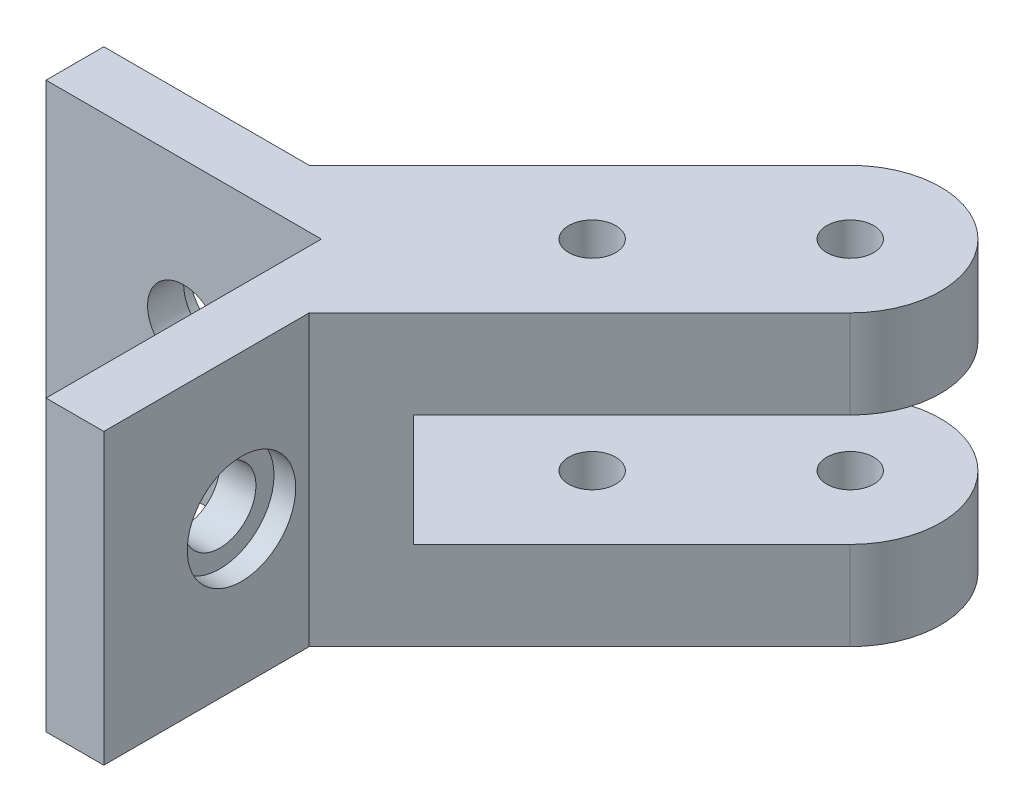
ISO-10303-21;
HEADER;
FILE_DESCRIPTION(('STEP AP214'),'2;1');
FILE_NAME('part.step','',(''),(''),'','','');
FILE_SCHEMA(('AUTOMOTIVE_DESIGN { 1 0 10303 214 1 1 1 1 }'));
ENDSEC;
DATA;
#1=APPLICATION_CONTEXT('core data for automotive mechanical design processes');
#2=APPLICATION_PROTOCOL_DEFINITION('international standard','automotive_design',2000,#1);
#3=PRODUCT_CONTEXT('',#1,'mechanical');
#4=PRODUCT('Part','Part','',(#3));
#5=PRODUCT_RELATED_PRODUCT_CATEGORY('part','',(#4));
#6=PRODUCT_DEFINITION_FORMATION('','',#4);
#7=PRODUCT_DEFINITION_CONTEXT('part definition',#1,'design');
#8=PRODUCT_DEFINITION('design','',#6,#7);
#9=PRODUCT_DEFINITION_SHAPE('','',#8);
#10=(LENGTH_UNIT() NAMED_UNIT(*) SI_UNIT(.MILLI.,.METRE.));
#11=(NAMED_UNIT(*) PLANE_ANGLE_UNIT() SI_UNIT($,.RADIAN.));
#12=(NAMED_UNIT(*) SI_UNIT($,.STERADIAN.) SOLID_ANGLE_UNIT());
#13=UNCERTAINTY_MEASURE_WITH_UNIT(LENGTH_MEASURE(1.E-05),#10,'distance_accuracy_value','');
#14=(GEOMETRIC_REPRESENTATION_CONTEXT(3) GLOBAL_UNCERTAINTY_ASSIGNED_CONTEXT((#13)) GLOBAL_UNIT_ASSIGNED_CONTEXT((#10,
#11,#12)) REPRESENTATION_CONTEXT('',''));
#15=CARTESIAN_POINT('',(0.,0.,0.));
#16=DIRECTION('',(0.,0.,1.));
#17=DIRECTION('',(1.,0.,0.));
#18=AXIS2_PLACEMENT_3D('',#15,#16,#17);
#19=CARTESIAN_POINT('',(-19.05,20.,-50.));
#20=DIRECTION('',(0.,0.,1.));
#21=DIRECTION('',(1.,0.,0.));
#22=AXIS2_PLACEMENT_3D('',#19,#20,#21);
#23=CYLINDRICAL_SURFACE('',#22,5.);
#24=CARTESIAN_POINT('',(-19.05,20.,0.));
#25=DIRECTION('',(0.,0.,1.));
#26=DIRECTION('',(1.,0.,0.));
#27=AXIS2_PLACEMENT_3D('',#24,#25,#26);
#28=CIRCLE('',#27,5.);
#29=CARTESIAN_POINT('',(-14.05,20.,0.));
#30=VERTEX_POINT('',#29);
#31=EDGE_CURVE('E319',#30,#30,#28,.T.);
#32=ORIENTED_EDGE('',*,*,#31,.T.);
#33=EDGE_LOOP('',(#32));
#34=FACE_BOUND('',#33,.T.);
#35=CARTESIAN_POINT('',(-19.05,20.,-5.));
#36=DIRECTION('',(0.,0.,-1.));
#37=DIRECTION('',(-1.,0.,0.));
#38=AXIS2_PLACEMENT_3D('',#35,#36,#37);
#39=CIRCLE('',#38,5.);
#40=CARTESIAN_POINT('',(-24.05,20.,-5.));
#41=VERTEX_POINT('',#40);
#42=EDGE_CURVE('E43',#41,#41,#39,.F.);
#43=ORIENTED_EDGE('',*,*,#42,.F.);
#44=EDGE_LOOP('',(#43));
#45=FACE_BOUND('',#44,.T.);
#46=ADVANCED_FACE('F39',(#34,#45),#23,.F.);
#47=CARTESIAN_POINT('',(36.5927759264038,0.,-36.5927759264039));
#48=DIRECTION('',(0.,1.,0.));
#49=DIRECTION('',(0.,0.,1.));
#50=AXIS2_PLACEMENT_3D('',#47,#48,#49);
#51=PLANE('',#50);
#52=DIRECTION('',(0.707106781186552,0.,0.707106781186543));
#53=VECTOR('',#52,1.);
#54=CARTESIAN_POINT('',(30.9044650609867,0.,-35.0685976237182));
#55=LINE('',#54,#53);
#56=CARTESIAN_POINT('',(30.9044650609867,0.,-35.0685976237182));
#57=VERTEX_POINT('',#56);
#58=CARTESIAN_POINT('',(35.0685976237181,0.,-30.9044650609868));
#59=VERTEX_POINT('',#58);
#60=EDGE_CURVE('E65',#57,#59,#55,.T.);
#61=ORIENTED_EDGE('',*,*,#60,.T.);
#62=DIRECTION('',(0.965925826289067,0.,-0.258819045102524));
#63=VECTOR('',#62,1.);
#64=CARTESIAN_POINT('',(35.0685976237181,0.,-30.9044650609868));
#65=LINE('',#64,#63);
#66=CARTESIAN_POINT('',(40.7569084891352,0.,-32.4286433636725));
#67=VERTEX_POINT('',#66);
#68=EDGE_CURVE('E270',#59,#67,#65,.T.);
#69=ORIENTED_EDGE('',*,*,#68,.T.);
#70=DIRECTION('',(0.258819045102512,0.,-0.965925826289071));
#71=VECTOR('',#70,1.);
#72=CARTESIAN_POINT('',(40.7569084891352,0.,-32.4286433636725));
#73=LINE('',#72,#71);
#74=CARTESIAN_POINT('',(42.2810867918208,0.,-38.1169542290896));
#75=VERTEX_POINT('',#74);
#76=EDGE_CURVE('E274',#67,#75,#73,.T.);
#77=ORIENTED_EDGE('',*,*,#76,.T.);
#78=DIRECTION('',(-0.707106781186552,0.,-0.707106781186543));
#79=VECTOR('',#78,1.);
#80=CARTESIAN_POINT('',(42.2810867918208,0.,-38.1169542290896));
#81=LINE('',#80,#79);
#82=CARTESIAN_POINT('',(38.1169542290894,0.,-42.281086791821));
#83=VERTEX_POINT('',#82);
#84=EDGE_CURVE('E278',#75,#83,#81,.T.);
#85=ORIENTED_EDGE('',*,*,#84,.T.);
#86=DIRECTION('',(-0.965925826289068,0.,0.258819045102522));
#87=VECTOR('',#86,1.);
#88=CARTESIAN_POINT('',(38.1169542290894,0.,-42.281086791821));
#89=LINE('',#88,#87);
#90=CARTESIAN_POINT('',(32.4286433636723,0.,-40.7569084891353));
#91=VERTEX_POINT('',#90);
#92=EDGE_CURVE('E282',#83,#91,#89,.T.);
#93=ORIENTED_EDGE('',*,*,#92,.T.);
#94=DIRECTION('',(-0.258819045102509,0.,0.965925826289071));
#95=VECTOR('',#94,1.);
#96=CARTESIAN_POINT('',(32.4286433636723,0.,-40.7569084891353));
#97=LINE('',#96,#95);
#98=EDGE_CURVE('E252',#91,#57,#97,.T.);
#99=ORIENTED_EDGE('',*,*,#98,.T.);
#100=EDGE_LOOP('',(#61,#69,#77,#85,#93,#99));
#101=FACE_BOUND('',#100,.T.);
#102=DIRECTION('',(1.,0.,0.));
#103=VECTOR('',#102,1.);
#104=CARTESIAN_POINT('',(0.,0.,0.));
#105=LINE('',#104,#103);
#106=CARTESIAN_POINT('',(-38.1,0.,0.));
#107=VERTEX_POINT('',#106);
#108=CARTESIAN_POINT('',(0.,0.,0.));
#109=VERTEX_POINT('',#108);
#110=EDGE_CURVE('E377',#107,#109,#105,.T.);
#111=ORIENTED_EDGE('',*,*,#110,.F.);
#112=DIRECTION('',(0.,0.,1.));
#113=VECTOR('',#112,1.);
#114=CARTESIAN_POINT('',(-38.1,0.,0.));
#115=LINE('',#114,#113);
#116=CARTESIAN_POINT('',(-38.1,0.,-8.));
#117=VERTEX_POINT('',#116);
#118=EDGE_CURVE('E383',#117,#107,#115,.T.);
#119=ORIENTED_EDGE('',*,*,#118,.F.);
#120=DIRECTION('',(-1.,0.,0.));
#121=VECTOR('',#120,1.);
#122=CARTESIAN_POINT('',(-38.1,0.,-8.));
#123=LINE('',#122,#121);
#124=CARTESIAN_POINT('',(-9.67766952966368,0.,-8.));
#125=VERTEX_POINT('',#124);
#126=EDGE_CURVE('E431',#125,#117,#123,.T.);
#127=ORIENTED_EDGE('',*,*,#126,.F.);
#128=DIRECTION('',(-0.707106781186546,0.,0.707106781186549));
#129=VECTOR('',#128,1.);
#130=CARTESIAN_POINT('',(-9.67766952966368,0.,-8.));
#131=LINE('',#130,#129);
#132=CARTESIAN_POINT('',(27.7539411615719,0.,-45.4316106912357));
#133=VERTEX_POINT('',#132);
#134=EDGE_CURVE('E428',#133,#125,#131,.T.);
#135=ORIENTED_EDGE('',*,*,#134,.F.);
#136=CARTESIAN_POINT('',(36.5927759264038,0.,-36.5927759264039));
#137=DIRECTION('',(0.,1.,0.));
#138=DIRECTION('',(0.,0.,1.));
#139=AXIS2_PLACEMENT_3D('',#136,#137,#138);
#140=CIRCLE('',#139,12.5);
#141=CARTESIAN_POINT('',(45.4316106912356,0.,-27.7539411615721));
#142=VERTEX_POINT('',#141);
#143=EDGE_CURVE('E424',#142,#133,#140,.T.);
#144=ORIENTED_EDGE('',*,*,#143,.F.);
#145=DIRECTION('',(0.707106781186546,0.,-0.707106781186549));
#146=VECTOR('',#145,1.);
#147=CARTESIAN_POINT('',(8.00000000000004,0.,9.67766952966366));
#148=LINE('',#147,#146);
#149=CARTESIAN_POINT('',(8.00000000000004,0.,9.67766952966366));
#150=VERTEX_POINT('',#149);
#151=EDGE_CURVE('E420',#150,#142,#148,.T.);
#152=ORIENTED_EDGE('',*,*,#151,.F.);
#153=DIRECTION('',(0.,0.,-1.));
#154=VECTOR('',#153,1.);
#155=CARTESIAN_POINT('',(8.00000000000004,0.,9.67766952966366));
#156=LINE('',#155,#154);
#157=CARTESIAN_POINT('',(8.00000000000001,0.,38.1));
#158=VERTEX_POINT('',#157);
#159=EDGE_CURVE('E417',#158,#150,#156,.T.);
#160=ORIENTED_EDGE('',*,*,#159,.F.);
#161=DIRECTION('',(1.,0.,0.));
#162=VECTOR('',#161,1.);
#163=CARTESIAN_POINT('',(8.00000000000001,0.,38.1));
#164=LINE('',#163,#162);
#165=CARTESIAN_POINT('',(0.,0.,38.1));
#166=VERTEX_POINT('',#165);
#167=EDGE_CURVE('E414',#166,#158,#164,.T.);
#168=ORIENTED_EDGE('',*,*,#167,.F.);
#169=DIRECTION('',(0.,0.,1.));
#170=VECTOR('',#169,1.);
#171=CARTESIAN_POINT('',(0.,0.,38.1));
#172=LINE('',#171,#170);
#173=EDGE_CURVE('E411',#109,#166,#172,.T.);
#174=ORIENTED_EDGE('',*,*,#173,.F.);
#175=EDGE_LOOP('',(#111,#119,#127,#135,#144,#152,#160,#168,#174));
#176=FACE_BOUND('',#175,.T.);
#177=DIRECTION('',(-0.965925826289067,0.,0.258819045102527));
#178=VECTOR('',#177,1.);
#179=CARTESIAN_POINT('',(20.2625080041291,0.,-24.4266405668606));
#180=LINE('',#179,#178);
#181=CARTESIAN_POINT('',(20.2625080041291,0.,-24.4266405668606));
#182=VERTEX_POINT('',#181);
#183=CARTESIAN_POINT('',(14.574197138712,0.,-22.9024622641749));
#184=VERTEX_POINT('',#183);
#185=EDGE_CURVE('E57',#182,#184,#180,.T.);
#186=ORIENTED_EDGE('',*,*,#185,.T.);
#187=DIRECTION('',(-0.258819045102514,0.,0.96592582628907));
#188=VECTOR('',#187,1.);
#189=CARTESIAN_POINT('',(14.574197138712,0.,-22.9024622641749));
#190=LINE('',#189,#188);
#191=CARTESIAN_POINT('',(13.0500188360264,0.,-17.2141513987578));
#192=VERTEX_POINT('',#191);
#193=EDGE_CURVE('E233',#184,#192,#190,.T.);
#194=ORIENTED_EDGE('',*,*,#193,.T.);
#195=DIRECTION('',(0.707106781186552,0.,0.707106781186543));
#196=VECTOR('',#195,1.);
#197=CARTESIAN_POINT('',(13.0500188360264,0.,-17.2141513987578));
#198=LINE('',#197,#196);
#199=CARTESIAN_POINT('',(17.2141513987578,0.,-13.0500188360264));
#200=VERTEX_POINT('',#199);
#201=EDGE_CURVE('E662',#192,#200,#198,.T.);
#202=ORIENTED_EDGE('',*,*,#201,.T.);
#203=DIRECTION('',(0.965925826289067,0.,-0.258819045102527));
#204=VECTOR('',#203,1.);
#205=CARTESIAN_POINT('',(17.2141513987578,0.,-13.0500188360264));
#206=LINE('',#205,#204);
#207=CARTESIAN_POINT('',(22.9024622641749,0.,-14.5741971387122));
#208=VERTEX_POINT('',#207);
#209=EDGE_CURVE('E666',#200,#208,#206,.T.);
#210=ORIENTED_EDGE('',*,*,#209,.T.);
#211=DIRECTION('',(0.258819045102515,0.,-0.96592582628907));
#212=VECTOR('',#211,1.);
#213=CARTESIAN_POINT('',(22.9024622641749,0.,-14.5741971387122));
#214=LINE('',#213,#212);
#215=CARTESIAN_POINT('',(24.4266405668606,0.,-20.2625080041293));
#216=VERTEX_POINT('',#215);
#217=EDGE_CURVE('E670',#208,#216,#214,.T.);
#218=ORIENTED_EDGE('',*,*,#217,.T.);
#219=DIRECTION('',(-0.707106781186552,0.,-0.707106781186543));
#220=VECTOR('',#219,1.);
#221=CARTESIAN_POINT('',(24.4266405668606,0.,-20.2625080041293));
#222=LINE('',#221,#220);
#223=EDGE_CURVE('E229',#216,#182,#222,.T.);
#224=ORIENTED_EDGE('',*,*,#223,.T.);
#225=EDGE_LOOP('',(#186,#194,#202,#210,#218,#224));
#226=FACE_BOUND('',#225,.T.);
#227=ADVANCED_FACE('F523',(#101,#176,#226),#51,.F.);
#228=CARTESIAN_POINT('',(50.,20.,19.05));
#229=DIRECTION('',(-1.,0.,0.));
#230=DIRECTION('',(0.,0.,1.));
#231=AXIS2_PLACEMENT_3D('',#228,#229,#230);
#232=CYLINDRICAL_SURFACE('',#231,5.);
#233=CARTESIAN_POINT('',(0.,20.,19.05));
#234=DIRECTION('',(-1.,0.,0.));
#235=DIRECTION('',(0.,0.,1.));
#236=AXIS2_PLACEMENT_3D('',#233,#234,#235);
#237=CIRCLE('',#236,5.);
#238=CARTESIAN_POINT('',(0.,20.,24.05));
#239=VERTEX_POINT('',#238);
#240=EDGE_CURVE('E315',#239,#239,#237,.T.);
#241=ORIENTED_EDGE('',*,*,#240,.T.);
#242=EDGE_LOOP('',(#241));
#243=FACE_BOUND('',#242,.T.);
#244=CARTESIAN_POINT('',(5.00000000000005,20.,19.05));
#245=DIRECTION('',(1.,0.,0.));
#246=DIRECTION('',(0.,0.,-1.));
#247=AXIS2_PLACEMENT_3D('',#244,#245,#246);
#248=CIRCLE('',#247,5.);
#249=CARTESIAN_POINT('',(5.00000000000005,20.,14.05));
#250=VERTEX_POINT('',#249);
#251=EDGE_CURVE('E310',#250,#250,#248,.F.);
#252=ORIENTED_EDGE('',*,*,#251,.F.);
#253=EDGE_LOOP('',(#252));
#254=FACE_BOUND('',#253,.T.);
#255=ADVANCED_FACE('F560',(#243,#254),#232,.F.);
#256=CARTESIAN_POINT('',(36.5927759264038,40.,-36.5927759264039));
#257=DIRECTION('',(0.,-1.,0.));
#258=DIRECTION('',(0.,0.,-1.));
#259=AXIS2_PLACEMENT_3D('',#256,#257,#258);
#260=CYLINDRICAL_SURFACE('',#259,12.5);
#261=DIRECTION('',(0.,-1.,0.));
#262=VECTOR('',#261,1.);
#263=CARTESIAN_POINT('',(27.7539411615719,40.,-45.4316106912357));
#264=LINE('',#263,#262);
#265=CARTESIAN_POINT('',(27.7539411615719,12.25,-45.4316106912357));
#266=VERTEX_POINT('',#265);
#267=EDGE_CURVE('E447',#266,#133,#264,.T.);
#268=ORIENTED_EDGE('',*,*,#267,.F.);
#269=CARTESIAN_POINT('',(36.5927759264038,12.25,-36.5927759264039));
#270=DIRECTION('',(0.,-1.,0.));
#271=DIRECTION('',(0.,0.,-1.));
#272=AXIS2_PLACEMENT_3D('',#269,#270,#271);
#273=CIRCLE('',#272,12.5);
#274=CARTESIAN_POINT('',(45.4316106912356,12.25,-27.7539411615721));
#275=VERTEX_POINT('',#274);
#276=EDGE_CURVE('E357',#266,#275,#273,.T.);
#277=ORIENTED_EDGE('',*,*,#276,.T.);
#278=DIRECTION('',(0.,-1.,0.));
#279=VECTOR('',#278,1.);
#280=CARTESIAN_POINT('',(45.4316106912356,40.,-27.7539411615721));
#281=LINE('',#280,#279);
#282=EDGE_CURVE('E452',#275,#142,#281,.T.);
#283=ORIENTED_EDGE('',*,*,#282,.T.);
#284=ORIENTED_EDGE('',*,*,#143,.T.);
#285=EDGE_LOOP('',(#268,#277,#283,#284));
#286=FACE_BOUND('',#285,.T.);
#287=ADVANCED_FACE('F491',(#286),#260,.T.);
#288=CARTESIAN_POINT('',(36.5927759264038,40.,-36.5927759264039));
#289=DIRECTION('',(0.,-1.,0.));
#290=DIRECTION('',(0.,0.,-1.));
#291=AXIS2_PLACEMENT_3D('',#288,#289,#290);
#292=CYLINDRICAL_SURFACE('',#291,3.25);
#293=CARTESIAN_POINT('',(36.5927759264038,5.1,-36.5927759264039));
#294=DIRECTION('',(0.,1.,0.));
#295=DIRECTION('',(0.,0.,1.));
#296=AXIS2_PLACEMENT_3D('',#293,#294,#295);
#297=CIRCLE('',#296,3.25);
#298=CARTESIAN_POINT('',(36.5927759264038,5.1,-33.3427759264039));
#299=VERTEX_POINT('',#298);
#300=EDGE_CURVE('E241',#299,#299,#297,.T.);
#301=ORIENTED_EDGE('',*,*,#300,.F.);
#302=EDGE_LOOP('',(#301));
#303=FACE_BOUND('',#302,.T.);
#304=CARTESIAN_POINT('',(36.5927759264038,12.25,-36.5927759264039));
#305=DIRECTION('',(0.,-1.,0.));
#306=DIRECTION('',(0.,0.,-1.));
#307=AXIS2_PLACEMENT_3D('',#304,#305,#306);
#308=CIRCLE('',#307,3.25);
#309=CARTESIAN_POINT('',(36.5927759264038,12.25,-39.8427759264039));
#310=VERTEX_POINT('',#309);
#311=EDGE_CURVE('E349',#310,#310,#308,.T.);
#312=ORIENTED_EDGE('',*,*,#311,.F.);
#313=EDGE_LOOP('',(#312));
#314=FACE_BOUND('',#313,.T.);
#315=ADVANCED_FACE('F487',(#303,#314),#292,.F.);
#316=CARTESIAN_POINT('',(18.7383297014435,40.,-18.7383297014435));
#317=DIRECTION('',(0.,-1.,0.));
#318=DIRECTION('',(0.,0.,-1.));
#319=AXIS2_PLACEMENT_3D('',#316,#317,#318);
#320=CYLINDRICAL_SURFACE('',#319,3.25);
#321=CARTESIAN_POINT('',(18.7383297014435,5.1,-18.7383297014435));
#322=DIRECTION('',(0.,1.,0.));
#323=DIRECTION('',(0.,0.,1.));
#324=AXIS2_PLACEMENT_3D('',#321,#322,#323);
#325=CIRCLE('',#324,3.25);
#326=CARTESIAN_POINT('',(18.7383297014435,5.1,-15.4883297014435));
#327=VERTEX_POINT('',#326);
#328=EDGE_CURVE('E235',#327,#327,#325,.T.);
#329=ORIENTED_EDGE('',*,*,#328,.F.);
#330=EDGE_LOOP('',(#329));
#331=FACE_BOUND('',#330,.T.);
#332=CARTESIAN_POINT('',(18.7383297014435,12.25,-18.7383297014435));
#333=DIRECTION('',(0.,-1.,0.));
#334=DIRECTION('',(0.,0.,-1.));
#335=AXIS2_PLACEMENT_3D('',#332,#333,#334);
#336=CIRCLE('',#335,3.25);
#337=CARTESIAN_POINT('',(18.7383297014435,12.25,-21.9883297014435));
#338=VERTEX_POINT('',#337);
#339=EDGE_CURVE('E348',#338,#338,#336,.T.);
#340=ORIENTED_EDGE('',*,*,#339,.F.);
#341=EDGE_LOOP('',(#340));
#342=FACE_BOUND('',#341,.T.);
#343=ADVANCED_FACE('F490',(#331,#342),#320,.F.);
#344=CARTESIAN_POINT('',(36.5927759264038,40.,-36.5927759264039));
#345=DIRECTION('',(0.,1.,0.));
#346=DIRECTION('',(0.,0.,1.));
#347=AXIS2_PLACEMENT_3D('',#344,#345,#346);
#348=PLANE('',#347);
#349=CARTESIAN_POINT('',(36.5927759264038,40.,-36.5927759264039));
#350=DIRECTION('',(0.,1.,0.));
#351=DIRECTION('',(0.,0.,1.));
#352=AXIS2_PLACEMENT_3D('',#349,#350,#351);
#353=CIRCLE('',#352,3.25);
#354=CARTESIAN_POINT('',(36.5927759264038,40.,-33.3427759264039));
#355=VERTEX_POINT('',#354);
#356=EDGE_CURVE('E373',#355,#355,#353,.T.);
#357=ORIENTED_EDGE('',*,*,#356,.F.);
#358=EDGE_LOOP('',(#357));
#359=FACE_BOUND('',#358,.T.);
#360=DIRECTION('',(1.,0.,0.));
#361=VECTOR('',#360,1.);
#362=CARTESIAN_POINT('',(0.,40.,0.));
#363=LINE('',#362,#361);
#364=CARTESIAN_POINT('',(-38.1,40.,0.));
#365=VERTEX_POINT('',#364);
#366=CARTESIAN_POINT('',(0.,40.,0.));
#367=VERTEX_POINT('',#366);
#368=EDGE_CURVE('E378',#365,#367,#363,.T.);
#369=ORIENTED_EDGE('',*,*,#368,.T.);
#370=DIRECTION('',(0.,0.,1.));
#371=VECTOR('',#370,1.);
#372=CARTESIAN_POINT('',(0.,40.,38.1));
#373=LINE('',#372,#371);
#374=CARTESIAN_POINT('',(0.,40.,38.1));
#375=VERTEX_POINT('',#374);
#376=EDGE_CURVE('E382',#367,#375,#373,.T.);
#377=ORIENTED_EDGE('',*,*,#376,.T.);
#378=DIRECTION('',(1.,0.,0.));
#379=VECTOR('',#378,1.);
#380=CARTESIAN_POINT('',(8.00000000000001,40.,38.1));
#381=LINE('',#380,#379);
#382=CARTESIAN_POINT('',(8.00000000000001,40.,38.1));
#383=VERTEX_POINT('',#382);
#384=EDGE_CURVE('E386',#375,#383,#381,.T.);
#385=ORIENTED_EDGE('',*,*,#384,.T.);
#386=DIRECTION('',(0.,0.,-1.));
#387=VECTOR('',#386,1.);
#388=CARTESIAN_POINT('',(8.00000000000004,40.,9.67766952966366));
#389=LINE('',#388,#387);
#390=CARTESIAN_POINT('',(8.00000000000004,40.,9.67766952966366));
#391=VERTEX_POINT('',#390);
#392=EDGE_CURVE('E389',#383,#391,#389,.T.);
#393=ORIENTED_EDGE('',*,*,#392,.T.);
#394=DIRECTION('',(0.707106781186546,0.,-0.707106781186549));
#395=VECTOR('',#394,1.);
#396=CARTESIAN_POINT('',(8.00000000000004,40.,9.67766952966366));
#397=LINE('',#396,#395);
#398=CARTESIAN_POINT('',(45.4316106912356,40.,-27.7539411615721));
#399=VERTEX_POINT('',#398);
#400=EDGE_CURVE('E392',#391,#399,#397,.T.);
#401=ORIENTED_EDGE('',*,*,#400,.T.);
#402=CARTESIAN_POINT('',(36.5927759264038,40.,-36.5927759264039));
#403=DIRECTION('',(0.,1.,0.));
#404=DIRECTION('',(0.,0.,1.));
#405=AXIS2_PLACEMENT_3D('',#402,#403,#404);
#406=CIRCLE('',#405,12.5);
#407=CARTESIAN_POINT('',(27.7539411615719,40.,-45.4316106912357));
#408=VERTEX_POINT('',#407);
#409=EDGE_CURVE('E395',#399,#408,#406,.T.);
#410=ORIENTED_EDGE('',*,*,#409,.T.);
#411=DIRECTION('',(-0.707106781186546,0.,0.707106781186549));
#412=VECTOR('',#411,1.);
#413=CARTESIAN_POINT('',(-9.67766952966368,40.,-8.));
#414=LINE('',#413,#412);
#415=CARTESIAN_POINT('',(-9.67766952966368,40.,-8.));
#416=VERTEX_POINT('',#415);
#417=EDGE_CURVE('E398',#408,#416,#414,.T.);
#418=ORIENTED_EDGE('',*,*,#417,.T.);
#419=DIRECTION('',(-1.,0.,0.));
#420=VECTOR('',#419,1.);
#421=CARTESIAN_POINT('',(-38.1,40.,-8.));
#422=LINE('',#421,#420);
#423=CARTESIAN_POINT('',(-38.1,40.,-8.));
#424=VERTEX_POINT('',#423);
#425=EDGE_CURVE('E401',#416,#424,#422,.T.);
#426=ORIENTED_EDGE('',*,*,#425,.T.);
#427=DIRECTION('',(0.,0.,1.));
#428=VECTOR('',#427,1.);
#429=CARTESIAN_POINT('',(-38.1,40.,0.));
#430=LINE('',#429,#428);
#431=EDGE_CURVE('E404',#424,#365,#430,.T.);
#432=ORIENTED_EDGE('',*,*,#431,.T.);
#433=EDGE_LOOP('',(#369,#377,#385,#393,#401,#410,#418,#426,#432));
#434=FACE_BOUND('',#433,.T.);
#435=CARTESIAN_POINT('',(18.7383297014435,40.,-18.7383297014435));
#436=DIRECTION('',(0.,1.,0.));
#437=DIRECTION('',(0.,0.,1.));
#438=AXIS2_PLACEMENT_3D('',#435,#436,#437);
#439=CIRCLE('',#438,3.25);
#440=CARTESIAN_POINT('',(18.7383297014435,40.,-15.4883297014435));
#441=VERTEX_POINT('',#440);
#442=EDGE_CURVE('E369',#441,#441,#439,.T.);
#443=ORIENTED_EDGE('',*,*,#442,.F.);
#444=EDGE_LOOP('',(#443));
#445=FACE_BOUND('',#444,.T.);
#446=ADVANCED_FACE('F535',(#359,#434,#445),#348,.T.);
#447=CARTESIAN_POINT('',(0.,40.,0.));
#448=DIRECTION('',(0.,0.,-1.));
#449=DIRECTION('',(-1.,0.,0.));
#450=AXIS2_PLACEMENT_3D('',#447,#448,#449);
#451=PLANE('',#450);
#452=ORIENTED_EDGE('',*,*,#31,.F.);
#453=EDGE_LOOP('',(#452));
#454=FACE_BOUND('',#453,.T.);
#455=ORIENTED_EDGE('',*,*,#110,.T.);
#456=DIRECTION('',(0.,-1.,0.));
#457=VECTOR('',#456,1.);
#458=CARTESIAN_POINT('',(0.,40.,0.));
#459=LINE('',#458,#457);
#460=EDGE_CURVE('E49',#367,#109,#459,.T.);
#461=ORIENTED_EDGE('',*,*,#460,.F.);
#462=ORIENTED_EDGE('',*,*,#368,.F.);
#463=DIRECTION('',(0.,-1.,0.));
#464=VECTOR('',#463,1.);
#465=CARTESIAN_POINT('',(-38.1,40.,0.));
#466=LINE('',#465,#464);
#467=EDGE_CURVE('E407',#365,#107,#466,.T.);
#468=ORIENTED_EDGE('',*,*,#467,.T.);
#469=EDGE_LOOP('',(#455,#461,#462,#468));
#470=FACE_BOUND('',#469,.T.);
#471=ADVANCED_FACE('F41',(#454,#470),#451,.F.);
#472=CARTESIAN_POINT('',(0.,40.,38.1));
#473=DIRECTION('',(1.,0.,0.));
#474=DIRECTION('',(0.,0.,-1.));
#475=AXIS2_PLACEMENT_3D('',#472,#473,#474);
#476=PLANE('',#475);
#477=ORIENTED_EDGE('',*,*,#240,.F.);
#478=EDGE_LOOP('',(#477));
#479=FACE_BOUND('',#478,.T.);
#480=ORIENTED_EDGE('',*,*,#173,.T.);
#481=DIRECTION('',(0.,-1.,0.));
#482=VECTOR('',#481,1.);
#483=CARTESIAN_POINT('',(0.,40.,38.1));
#484=LINE('',#483,#482);
#485=EDGE_CURVE('E465',#375,#166,#484,.T.);
#486=ORIENTED_EDGE('',*,*,#485,.F.);
#487=ORIENTED_EDGE('',*,*,#376,.F.);
#488=ORIENTED_EDGE('',*,*,#460,.T.);
#489=EDGE_LOOP('',(#480,#486,#487,#488));
#490=FACE_BOUND('',#489,.T.);
#491=ADVANCED_FACE('F717',(#479,#490),#476,.F.);
#492=CARTESIAN_POINT('',(8.00000000000001,40.,38.1));
#493=DIRECTION('',(0.,0.,-1.));
#494=DIRECTION('',(-1.,0.,0.));
#495=AXIS2_PLACEMENT_3D('',#492,#493,#494);
#496=PLANE('',#495);
#497=ORIENTED_EDGE('',*,*,#167,.T.);
#498=DIRECTION('',(0.,-1.,0.));
#499=VECTOR('',#498,1.);
#500=CARTESIAN_POINT('',(8.00000000000001,40.,38.1));
#501=LINE('',#500,#499);
#502=EDGE_CURVE('E461',#383,#158,#501,.T.);
#503=ORIENTED_EDGE('',*,*,#502,.F.);
#504=ORIENTED_EDGE('',*,*,#384,.F.);
#505=ORIENTED_EDGE('',*,*,#485,.T.);
#506=EDGE_LOOP('',(#497,#503,#504,#505));
#507=FACE_BOUND('',#506,.T.);
#508=ADVANCED_FACE('F714',(#507),#496,.F.);
#509=CARTESIAN_POINT('',(8.00000000000004,40.,9.67766952966366));
#510=DIRECTION('',(-1.,0.,0.));
#511=DIRECTION('',(0.,0.,1.));
#512=AXIS2_PLACEMENT_3D('',#509,#510,#511);
#513=PLANE('',#512);
#514=CARTESIAN_POINT('',(8.00000000000005,20.,19.05));
#515=DIRECTION('',(1.,0.,0.));
#516=DIRECTION('',(0.,0.,-1.));
#517=AXIS2_PLACEMENT_3D('',#514,#515,#516);
#518=CIRCLE('',#517,7.5);
#519=CARTESIAN_POINT('',(8.00000000000005,20.,11.55));
#520=VERTEX_POINT('',#519);
#521=EDGE_CURVE('E311',#520,#520,#518,.T.);
#522=ORIENTED_EDGE('',*,*,#521,.F.);
#523=EDGE_LOOP('',(#522));
#524=FACE_BOUND('',#523,.T.);
#525=ORIENTED_EDGE('',*,*,#159,.T.);
#526=DIRECTION('',(0.,-1.,0.));
#527=VECTOR('',#526,1.);
#528=CARTESIAN_POINT('',(8.00000000000004,40.,9.67766952966366));
#529=LINE('',#528,#527);
#530=EDGE_CURVE('E457',#391,#150,#529,.T.);
#531=ORIENTED_EDGE('',*,*,#530,.F.);
#532=ORIENTED_EDGE('',*,*,#392,.F.);
#533=ORIENTED_EDGE('',*,*,#502,.T.);
#534=EDGE_LOOP('',(#525,#531,#532,#533));
#535=FACE_BOUND('',#534,.T.);
#536=ADVANCED_FACE('F711',(#524,#535),#513,.F.);
#537=CARTESIAN_POINT('',(8.00000000000004,40.,9.67766952966366));
#538=DIRECTION('',(-0.707106781186549,0.,-0.707106781186546));
#539=DIRECTION('',(-0.707106781186546,0.,0.707106781186549));
#540=AXIS2_PLACEMENT_3D('',#537,#538,#539);
#541=PLANE('',#540);
#542=ORIENTED_EDGE('',*,*,#282,.F.);
#543=DIRECTION('',(-0.707106781186546,0.,0.707106781186549));
#544=VECTOR('',#543,1.);
#545=CARTESIAN_POINT('',(8.00000000000004,12.25,9.67766952966365));
#546=LINE('',#545,#544);
#547=CARTESIAN_POINT('',(15.2027957955108,12.25,2.47487373415289));
#548=VERTEX_POINT('',#547);
#549=EDGE_CURVE('E361',#275,#548,#546,.T.);
#550=ORIENTED_EDGE('',*,*,#549,.T.);
#551=DIRECTION('',(0.,1.,0.));
#552=VECTOR('',#551,1.);
#553=CARTESIAN_POINT('',(15.2027957955108,40.,2.47487373415289));
#554=LINE('',#553,#552);
#555=CARTESIAN_POINT('',(15.2027957955108,27.75,2.47487373415289));
#556=VERTEX_POINT('',#555);
#557=EDGE_CURVE('E365',#548,#556,#554,.T.);
#558=ORIENTED_EDGE('',*,*,#557,.T.);
#559=DIRECTION('',(0.707106781186546,0.,-0.707106781186549));
#560=VECTOR('',#559,1.);
#561=CARTESIAN_POINT('',(8.00000000000004,27.75,9.67766952966366));
#562=LINE('',#561,#560);
#563=CARTESIAN_POINT('',(45.4316106912356,27.75,-27.7539411615721));
#564=VERTEX_POINT('',#563);
#565=EDGE_CURVE('E344',#556,#564,#562,.T.);
#566=ORIENTED_EDGE('',*,*,#565,.T.);
#567=EDGE_CURVE('E453',#399,#564,#281,.T.);
#568=ORIENTED_EDGE('',*,*,#567,.F.);
#569=ORIENTED_EDGE('',*,*,#400,.F.);
#570=ORIENTED_EDGE('',*,*,#530,.T.);
#571=ORIENTED_EDGE('',*,*,#151,.T.);
#572=EDGE_LOOP('',(#542,#550,#558,#566,#568,#569,#570,#571));
#573=FACE_BOUND('',#572,.T.);
#574=ADVANCED_FACE('F517',(#573),#541,.F.);
#575=ORIENTED_EDGE('',*,*,#567,.T.);
#576=CARTESIAN_POINT('',(36.5927759264038,27.75,-36.5927759264039));
#577=DIRECTION('',(0.,1.,0.));
#578=DIRECTION('',(0.,0.,1.));
#579=AXIS2_PLACEMENT_3D('',#576,#577,#578);
#580=CIRCLE('',#579,12.5);
#581=CARTESIAN_POINT('',(27.7539411615719,27.75,-45.4316106912357));
#582=VERTEX_POINT('',#581);
#583=EDGE_CURVE('E340',#564,#582,#580,.T.);
#584=ORIENTED_EDGE('',*,*,#583,.T.);
#585=EDGE_CURVE('E448',#408,#582,#264,.T.);
#586=ORIENTED_EDGE('',*,*,#585,.F.);
#587=ORIENTED_EDGE('',*,*,#409,.F.);
#588=EDGE_LOOP('',(#575,#584,#586,#587));
#589=FACE_BOUND('',#588,.T.);
#590=ADVANCED_FACE('F541',(#589),#260,.T.);
#591=CARTESIAN_POINT('',(-9.67766952966368,40.,-8.));
#592=DIRECTION('',(0.707106781186549,0.,0.707106781186546));
#593=DIRECTION('',(0.707106781186546,0.,-0.707106781186549));
#594=AXIS2_PLACEMENT_3D('',#591,#592,#593);
#595=PLANE('',#594);
#596=DIRECTION('',(0.,-1.,0.));
#597=VECTOR('',#596,1.);
#598=CARTESIAN_POINT('',(-2.47487373415295,40.,-15.2027957955108));
#599=LINE('',#598,#597);
#600=CARTESIAN_POINT('',(-2.47487373415294,27.75,-15.2027957955108));
#601=VERTEX_POINT('',#600);
#602=CARTESIAN_POINT('',(-2.47487373415294,12.25,-15.2027957955108));
#603=VERTEX_POINT('',#602);
#604=EDGE_CURVE('E11',#601,#603,#599,.T.);
#605=ORIENTED_EDGE('',*,*,#604,.T.);
#606=DIRECTION('',(0.707106781186546,0.,-0.707106781186549));
#607=VECTOR('',#606,1.);
#608=CARTESIAN_POINT('',(-9.67766952966368,12.25,-8.00000000000001));
#609=LINE('',#608,#607);
#610=EDGE_CURVE('E353',#603,#266,#609,.T.);
#611=ORIENTED_EDGE('',*,*,#610,.T.);
#612=ORIENTED_EDGE('',*,*,#267,.T.);
#613=ORIENTED_EDGE('',*,*,#134,.T.);
#614=DIRECTION('',(0.,-1.,0.));
#615=VECTOR('',#614,1.);
#616=CARTESIAN_POINT('',(-9.67766952966368,40.,-8.));
#617=LINE('',#616,#615);
#618=EDGE_CURVE('E443',#416,#125,#617,.T.);
#619=ORIENTED_EDGE('',*,*,#618,.F.);
#620=ORIENTED_EDGE('',*,*,#417,.F.);
#621=ORIENTED_EDGE('',*,*,#585,.T.);
#622=DIRECTION('',(-0.707106781186546,0.,0.707106781186549));
#623=VECTOR('',#622,1.);
#624=CARTESIAN_POINT('',(-9.67766952966368,27.75,-8.));
#625=LINE('',#624,#623);
#626=EDGE_CURVE('E336',#582,#601,#625,.T.);
#627=ORIENTED_EDGE('',*,*,#626,.T.);
#628=EDGE_LOOP('',(#605,#611,#612,#613,#619,#620,#621,#627));
#629=FACE_BOUND('',#628,.T.);
#630=ADVANCED_FACE('F509',(#629),#595,.F.);
#631=CARTESIAN_POINT('',(-38.1,40.,-8.));
#632=DIRECTION('',(0.,0.,1.));
#633=DIRECTION('',(1.,0.,0.));
#634=AXIS2_PLACEMENT_3D('',#631,#632,#633);
#635=PLANE('',#634);
#636=CARTESIAN_POINT('',(-19.05,20.,-8.));
#637=DIRECTION('',(0.,0.,-1.));
#638=DIRECTION('',(-1.,0.,0.));
#639=AXIS2_PLACEMENT_3D('',#636,#637,#638);
#640=CIRCLE('',#639,7.5);
#641=CARTESIAN_POINT('',(-26.55,20.,-8.));
#642=VERTEX_POINT('',#641);
#643=EDGE_CURVE('E641',#642,#642,#640,.T.);
#644=ORIENTED_EDGE('',*,*,#643,.F.);
#645=EDGE_LOOP('',(#644));
#646=FACE_BOUND('',#645,.T.);
#647=ORIENTED_EDGE('',*,*,#126,.T.);
#648=DIRECTION('',(0.,-1.,0.));
#649=VECTOR('',#648,1.);
#650=CARTESIAN_POINT('',(-38.1,40.,-8.));
#651=LINE('',#650,#649);
#652=EDGE_CURVE('E439',#424,#117,#651,.T.);
#653=ORIENTED_EDGE('',*,*,#652,.F.);
#654=ORIENTED_EDGE('',*,*,#425,.F.);
#655=ORIENTED_EDGE('',*,*,#618,.T.);
#656=EDGE_LOOP('',(#647,#653,#654,#655));
#657=FACE_BOUND('',#656,.T.);
#658=ADVANCED_FACE('F531',(#646,#657),#635,.F.);
#659=CARTESIAN_POINT('',(-38.1,40.,0.));
#660=DIRECTION('',(1.,0.,0.));
#661=DIRECTION('',(0.,0.,-1.));
#662=AXIS2_PLACEMENT_3D('',#659,#660,#661);
#663=PLANE('',#662);
#664=ORIENTED_EDGE('',*,*,#118,.T.);
#665=ORIENTED_EDGE('',*,*,#467,.F.);
#666=ORIENTED_EDGE('',*,*,#431,.F.);
#667=ORIENTED_EDGE('',*,*,#652,.T.);
#668=EDGE_LOOP('',(#664,#665,#666,#667));
#669=FACE_BOUND('',#668,.T.);
#670=ADVANCED_FACE('F697',(#669),#663,.F.);
#671=CARTESIAN_POINT('',(36.5927759264038,27.75,-36.5927759264039));
#672=DIRECTION('',(0.,1.,0.));
#673=DIRECTION('',(0.,0.,1.));
#674=AXIS2_PLACEMENT_3D('',#671,#672,#673);
#675=CIRCLE('',#674,3.25);
#676=CARTESIAN_POINT('',(36.5927759264038,27.75,-33.3427759264039));
#677=VERTEX_POINT('',#676);
#678=EDGE_CURVE('E332',#677,#677,#675,.T.);
#679=ORIENTED_EDGE('',*,*,#678,.F.);
#680=EDGE_LOOP('',(#679));
#681=FACE_BOUND('',#680,.T.);
#682=ORIENTED_EDGE('',*,*,#356,.T.);
#683=EDGE_LOOP('',(#682));
#684=FACE_BOUND('',#683,.T.);
#685=ADVANCED_FACE('F493',(#681,#684),#292,.F.);
#686=CARTESIAN_POINT('',(18.7383297014435,27.75,-18.7383297014435));
#687=DIRECTION('',(0.,1.,0.));
#688=DIRECTION('',(0.,0.,1.));
#689=AXIS2_PLACEMENT_3D('',#686,#687,#688);
#690=CIRCLE('',#689,3.25);
#691=CARTESIAN_POINT('',(18.7383297014435,27.75,-15.4883297014435));
#692=VERTEX_POINT('',#691);
#693=EDGE_CURVE('E328',#692,#692,#690,.T.);
#694=ORIENTED_EDGE('',*,*,#693,.F.);
#695=EDGE_LOOP('',(#694));
#696=FACE_BOUND('',#695,.T.);
#697=ORIENTED_EDGE('',*,*,#442,.T.);
#698=EDGE_LOOP('',(#697));
#699=FACE_BOUND('',#698,.T.);
#700=ADVANCED_FACE('F546',(#696,#699),#320,.F.);
#701=CARTESIAN_POINT('',(-37.2324269325231,12.25,-49.9603489938808));
#702=DIRECTION('',(-0.707106781186546,0.,0.707106781186549));
#703=DIRECTION('',(0.707106781186549,0.,0.707106781186546));
#704=AXIS2_PLACEMENT_3D('',#701,#702,#703);
#705=PLANE('',#704);
#706=DIRECTION('',(0.707106781186549,0.,0.707106781186546));
#707=VECTOR('',#706,1.);
#708=CARTESIAN_POINT('',(-37.2324269325231,12.25,-49.9603489938808));
#709=LINE('',#708,#707);
#710=EDGE_CURVE('E324',#603,#548,#709,.T.);
#711=ORIENTED_EDGE('',*,*,#710,.F.);
#712=ORIENTED_EDGE('',*,*,#604,.F.);
#713=DIRECTION('',(0.707106781186549,0.,0.707106781186546));
#714=VECTOR('',#713,1.);
#715=CARTESIAN_POINT('',(-37.2324269325231,27.75,-49.9603489938808));
#716=LINE('',#715,#714);
#717=EDGE_CURVE('E323',#601,#556,#716,.T.);
#718=ORIENTED_EDGE('',*,*,#717,.T.);
#719=ORIENTED_EDGE('',*,*,#557,.F.);
#720=EDGE_LOOP('',(#711,#712,#718,#719));
#721=FACE_BOUND('',#720,.T.);
#722=ADVANCED_FACE('F500',(#721),#705,.F.);
#723=CARTESIAN_POINT('',(-37.2324269325231,12.25,-49.9603489938808));
#724=DIRECTION('',(0.,-1.,0.));
#725=DIRECTION('',(0.,0.,-1.));
#726=AXIS2_PLACEMENT_3D('',#723,#724,#725);
#727=PLANE('',#726);
#728=ORIENTED_EDGE('',*,*,#311,.T.);
#729=EDGE_LOOP('',(#728));
#730=FACE_BOUND('',#729,.T.);
#731=ORIENTED_EDGE('',*,*,#339,.T.);
#732=EDGE_LOOP('',(#731));
#733=FACE_BOUND('',#732,.T.);
#734=ORIENTED_EDGE('',*,*,#276,.F.);
#735=ORIENTED_EDGE('',*,*,#610,.F.);
#736=ORIENTED_EDGE('',*,*,#710,.T.);
#737=ORIENTED_EDGE('',*,*,#549,.F.);
#738=EDGE_LOOP('',(#734,#735,#736,#737));
#739=FACE_BOUND('',#738,.T.);
#740=ADVANCED_FACE('F496',(#730,#733,#739),#727,.F.);
#741=CARTESIAN_POINT('',(-37.2324269325231,27.75,-49.9603489938808));
#742=DIRECTION('',(0.,1.,0.));
#743=DIRECTION('',(0.,0.,1.));
#744=AXIS2_PLACEMENT_3D('',#741,#742,#743);
#745=PLANE('',#744);
#746=ORIENTED_EDGE('',*,*,#678,.T.);
#747=EDGE_LOOP('',(#746));
#748=FACE_BOUND('',#747,.T.);
#749=ORIENTED_EDGE('',*,*,#693,.T.);
#750=EDGE_LOOP('',(#749));
#751=FACE_BOUND('',#750,.T.);
#752=ORIENTED_EDGE('',*,*,#717,.F.);
#753=ORIENTED_EDGE('',*,*,#626,.F.);
#754=ORIENTED_EDGE('',*,*,#583,.F.);
#755=ORIENTED_EDGE('',*,*,#565,.F.);
#756=EDGE_LOOP('',(#752,#753,#754,#755));
#757=FACE_BOUND('',#756,.T.);
#758=ADVANCED_FACE('F499',(#748,#751,#757),#745,.F.);
#759=CARTESIAN_POINT('',(5.00000000000005,20.,19.05));
#760=DIRECTION('',(1.,0.,0.));
#761=DIRECTION('',(0.,0.,-1.));
#762=AXIS2_PLACEMENT_3D('',#759,#760,#761);
#763=PLANE('',#762);
#764=CARTESIAN_POINT('',(5.00000000000005,20.,19.05));
#765=DIRECTION('',(1.,0.,0.));
#766=DIRECTION('',(0.,0.,-1.));
#767=AXIS2_PLACEMENT_3D('',#764,#765,#766);
#768=CIRCLE('',#767,7.5);
#769=CARTESIAN_POINT('',(5.00000000000005,20.,11.55));
#770=VERTEX_POINT('',#769);
#771=EDGE_CURVE('E306',#770,#770,#768,.T.);
#772=ORIENTED_EDGE('',*,*,#771,.T.);
#773=EDGE_LOOP('',(#772));
#774=FACE_BOUND('',#773,.T.);
#775=ORIENTED_EDGE('',*,*,#251,.T.);
#776=EDGE_LOOP('',(#775));
#777=FACE_BOUND('',#776,.T.);
#778=ADVANCED_FACE('F572',(#774,#777),#763,.T.);
#779=CARTESIAN_POINT('',(5.00000000000005,20.,19.05));
#780=DIRECTION('',(1.,0.,0.));
#781=DIRECTION('',(0.,0.,-1.));
#782=AXIS2_PLACEMENT_3D('',#779,#780,#781);
#783=CYLINDRICAL_SURFACE('',#782,7.5);
#784=ORIENTED_EDGE('',*,*,#771,.F.);
#785=EDGE_LOOP('',(#784));
#786=FACE_BOUND('',#785,.T.);
#787=ORIENTED_EDGE('',*,*,#521,.T.);
#788=EDGE_LOOP('',(#787));
#789=FACE_BOUND('',#788,.T.);
#790=ADVANCED_FACE('F568',(#786,#789),#783,.F.);
#791=CARTESIAN_POINT('',(30.9044650609867,5.1,-35.0685976237182));
#792=DIRECTION('',(0.707106781186543,0.,-0.707106781186552));
#793=DIRECTION('',(-0.707106781186552,0.,-0.707106781186543));
#794=AXIS2_PLACEMENT_3D('',#791,#792,#793);
#795=PLANE('',#794);
#796=ORIENTED_EDGE('',*,*,#60,.F.);
#797=DIRECTION('',(0.,-1.,0.));
#798=VECTOR('',#797,1.);
#799=CARTESIAN_POINT('',(30.9044650609867,5.1,-35.0685976237182));
#800=LINE('',#799,#798);
#801=CARTESIAN_POINT('',(30.9044650609867,5.1,-35.0685976237182));
#802=VERTEX_POINT('',#801);
#803=EDGE_CURVE('E267',#802,#57,#800,.T.);
#804=ORIENTED_EDGE('',*,*,#803,.F.);
#805=DIRECTION('',(0.707106781186552,0.,0.707106781186543));
#806=VECTOR('',#805,1.);
#807=CARTESIAN_POINT('',(30.9044650609867,5.1,-35.0685976237182));
#808=LINE('',#807,#806);
#809=CARTESIAN_POINT('',(35.0685976237181,5.1,-30.9044650609868));
#810=VERTEX_POINT('',#809);
#811=EDGE_CURVE('E247',#802,#810,#808,.T.);
#812=ORIENTED_EDGE('',*,*,#811,.T.);
#813=DIRECTION('',(0.,-1.,0.));
#814=VECTOR('',#813,1.);
#815=CARTESIAN_POINT('',(35.0685976237181,5.1,-30.9044650609868));
#816=LINE('',#815,#814);
#817=EDGE_CURVE('E303',#810,#59,#816,.T.);
#818=ORIENTED_EDGE('',*,*,#817,.T.);
#819=EDGE_LOOP('',(#796,#804,#812,#818));
#820=FACE_BOUND('',#819,.T.);
#821=ADVANCED_FACE('F571',(#820),#795,.T.);
#822=CARTESIAN_POINT('',(35.0685976237181,5.1,-30.9044650609868));
#823=DIRECTION('',(-0.258819045102524,0.,-0.965925826289067));
#824=DIRECTION('',(-0.965925826289068,0.,0.258819045102524));
#825=AXIS2_PLACEMENT_3D('',#822,#823,#824);
#826=PLANE('',#825);
#827=ORIENTED_EDGE('',*,*,#68,.F.);
#828=ORIENTED_EDGE('',*,*,#817,.F.);
#829=DIRECTION('',(0.965925826289067,0.,-0.258819045102524));
#830=VECTOR('',#829,1.);
#831=CARTESIAN_POINT('',(35.0685976237181,5.1,-30.9044650609868));
#832=LINE('',#831,#830);
#833=CARTESIAN_POINT('',(40.7569084891352,5.1,-32.4286433636725));
#834=VERTEX_POINT('',#833);
#835=EDGE_CURVE('E251',#810,#834,#832,.T.);
#836=ORIENTED_EDGE('',*,*,#835,.T.);
#837=DIRECTION('',(0.,-1.,0.));
#838=VECTOR('',#837,1.);
#839=CARTESIAN_POINT('',(40.7569084891352,5.1,-32.4286433636725));
#840=LINE('',#839,#838);
#841=EDGE_CURVE('E300',#834,#67,#840,.T.);
#842=ORIENTED_EDGE('',*,*,#841,.T.);
#843=EDGE_LOOP('',(#827,#828,#836,#842));
#844=FACE_BOUND('',#843,.T.);
#845=ADVANCED_FACE('F579',(#844),#826,.T.);
#846=CARTESIAN_POINT('',(40.7569084891352,5.1,-32.4286433636725));
#847=DIRECTION('',(-0.965925826289071,0.,-0.258819045102512));
#848=DIRECTION('',(-0.258819045102512,0.,0.965925826289071));
#849=AXIS2_PLACEMENT_3D('',#846,#847,#848);
#850=PLANE('',#849);
#851=ORIENTED_EDGE('',*,*,#76,.F.);
#852=ORIENTED_EDGE('',*,*,#841,.F.);
#853=DIRECTION('',(0.258819045102512,0.,-0.965925826289071));
#854=VECTOR('',#853,1.);
#855=CARTESIAN_POINT('',(40.7569084891352,5.1,-32.4286433636725));
#856=LINE('',#855,#854);
#857=CARTESIAN_POINT('',(42.2810867918208,5.1,-38.1169542290896));
#858=VERTEX_POINT('',#857);
#859=EDGE_CURVE('E255',#834,#858,#856,.T.);
#860=ORIENTED_EDGE('',*,*,#859,.T.);
#861=DIRECTION('',(0.,-1.,0.));
#862=VECTOR('',#861,1.);
#863=CARTESIAN_POINT('',(42.2810867918208,5.1,-38.1169542290896));
#864=LINE('',#863,#862);
#865=EDGE_CURVE('E297',#858,#75,#864,.T.);
#866=ORIENTED_EDGE('',*,*,#865,.T.);
#867=EDGE_LOOP('',(#851,#852,#860,#866));
#868=FACE_BOUND('',#867,.T.);
#869=ADVANCED_FACE('F582',(#868),#850,.T.);
#870=CARTESIAN_POINT('',(42.2810867918208,5.1,-38.1169542290896));
#871=DIRECTION('',(-0.707106781186543,0.,0.707106781186552));
#872=DIRECTION('',(0.707106781186552,0.,0.707106781186543));
#873=AXIS2_PLACEMENT_3D('',#870,#871,#872);
#874=PLANE('',#873);
#875=ORIENTED_EDGE('',*,*,#84,.F.);
#876=ORIENTED_EDGE('',*,*,#865,.F.);
#877=DIRECTION('',(-0.707106781186552,0.,-0.707106781186543));
#878=VECTOR('',#877,1.);
#879=CARTESIAN_POINT('',(42.2810867918208,5.1,-38.1169542290896));
#880=LINE('',#879,#878);
#881=CARTESIAN_POINT('',(38.1169542290894,5.1,-42.281086791821));
#882=VERTEX_POINT('',#881);
#883=EDGE_CURVE('E258',#858,#882,#880,.T.);
#884=ORIENTED_EDGE('',*,*,#883,.T.);
#885=DIRECTION('',(0.,-1.,0.));
#886=VECTOR('',#885,1.);
#887=CARTESIAN_POINT('',(38.1169542290894,5.1,-42.281086791821));
#888=LINE('',#887,#886);
#889=EDGE_CURVE('E294',#882,#83,#888,.T.);
#890=ORIENTED_EDGE('',*,*,#889,.T.);
#891=EDGE_LOOP('',(#875,#876,#884,#890));
#892=FACE_BOUND('',#891,.T.);
#893=ADVANCED_FACE('F586',(#892),#874,.T.);
#894=CARTESIAN_POINT('',(38.1169542290894,5.1,-42.281086791821));
#895=DIRECTION('',(0.258819045102522,0.,0.965925826289068));
#896=DIRECTION('',(0.965925826289068,0.,-0.258819045102522));
#897=AXIS2_PLACEMENT_3D('',#894,#895,#896);
#898=PLANE('',#897);
#899=ORIENTED_EDGE('',*,*,#92,.F.);
#900=ORIENTED_EDGE('',*,*,#889,.F.);
#901=DIRECTION('',(-0.965925826289068,0.,0.258819045102522));
#902=VECTOR('',#901,1.);
#903=CARTESIAN_POINT('',(38.1169542290894,5.1,-42.281086791821));
#904=LINE('',#903,#902);
#905=CARTESIAN_POINT('',(32.4286433636723,5.1,-40.7569084891353));
#906=VERTEX_POINT('',#905);
#907=EDGE_CURVE('E261',#882,#906,#904,.T.);
#908=ORIENTED_EDGE('',*,*,#907,.T.);
#909=DIRECTION('',(0.,-1.,0.));
#910=VECTOR('',#909,1.);
#911=CARTESIAN_POINT('',(32.4286433636723,5.1,-40.7569084891353));
#912=LINE('',#911,#910);
#913=EDGE_CURVE('E291',#906,#91,#912,.T.);
#914=ORIENTED_EDGE('',*,*,#913,.T.);
#915=EDGE_LOOP('',(#899,#900,#908,#914));
#916=FACE_BOUND('',#915,.T.);
#917=ADVANCED_FACE('F590',(#916),#898,.T.);
#918=CARTESIAN_POINT('',(32.4286433636723,5.1,-40.7569084891353));
#919=DIRECTION('',(0.965925826289071,0.,0.258819045102509));
#920=DIRECTION('',(0.258819045102509,0.,-0.965925826289071));
#921=AXIS2_PLACEMENT_3D('',#918,#919,#920);
#922=PLANE('',#921);
#923=ORIENTED_EDGE('',*,*,#98,.F.);
#924=ORIENTED_EDGE('',*,*,#913,.F.);
#925=DIRECTION('',(-0.258819045102509,0.,0.965925826289071));
#926=VECTOR('',#925,1.);
#927=CARTESIAN_POINT('',(32.4286433636723,5.1,-40.7569084891353));
#928=LINE('',#927,#926);
#929=EDGE_CURVE('E264',#906,#802,#928,.T.);
#930=ORIENTED_EDGE('',*,*,#929,.T.);
#931=ORIENTED_EDGE('',*,*,#803,.T.);
#932=EDGE_LOOP('',(#923,#924,#930,#931));
#933=FACE_BOUND('',#932,.T.);
#934=ADVANCED_FACE('F594',(#933),#922,.T.);
#935=CARTESIAN_POINT('',(0.,5.1,0.));
#936=DIRECTION('',(0.,1.,0.));
#937=DIRECTION('',(0.,0.,1.));
#938=AXIS2_PLACEMENT_3D('',#935,#936,#937);
#939=PLANE('',#938);
#940=ORIENTED_EDGE('',*,*,#300,.T.);
#941=EDGE_LOOP('',(#940));
#942=FACE_BOUND('',#941,.T.);
#943=ORIENTED_EDGE('',*,*,#811,.F.);
#944=ORIENTED_EDGE('',*,*,#929,.F.);
#945=ORIENTED_EDGE('',*,*,#907,.F.);
#946=ORIENTED_EDGE('',*,*,#883,.F.);
#947=ORIENTED_EDGE('',*,*,#859,.F.);
#948=ORIENTED_EDGE('',*,*,#835,.F.);
#949=EDGE_LOOP('',(#943,#944,#945,#946,#947,#948));
#950=FACE_BOUND('',#949,.T.);
#951=ADVANCED_FACE('F484',(#942,#950),#939,.F.);
#952=CARTESIAN_POINT('',(20.2625080041291,5.1,-24.4266405668606));
#953=DIRECTION('',(0.258819045102527,0.,0.965925826289067));
#954=DIRECTION('',(0.965925826289067,0.,-0.258819045102527));
#955=AXIS2_PLACEMENT_3D('',#952,#953,#954);
#956=PLANE('',#955);
#957=ORIENTED_EDGE('',*,*,#185,.F.);
#958=DIRECTION('',(0.,-1.,0.));
#959=VECTOR('',#958,1.);
#960=CARTESIAN_POINT('',(20.2625080041291,5.1,-24.4266405668606));
#961=LINE('',#960,#959);
#962=CARTESIAN_POINT('',(20.2625080041291,5.1,-24.4266405668606));
#963=VERTEX_POINT('',#962);
#964=EDGE_CURVE('E227',#963,#182,#961,.T.);
#965=ORIENTED_EDGE('',*,*,#964,.F.);
#966=DIRECTION('',(-0.965925826289067,0.,0.258819045102527));
#967=VECTOR('',#966,1.);
#968=CARTESIAN_POINT('',(20.2625080041291,5.1,-24.4266405668606));
#969=LINE('',#968,#967);
#970=CARTESIAN_POINT('',(14.574197138712,5.1,-22.9024622641749));
#971=VERTEX_POINT('',#970);
#972=EDGE_CURVE('E217',#963,#971,#969,.T.);
#973=ORIENTED_EDGE('',*,*,#972,.T.);
#974=DIRECTION('',(0.,-1.,0.));
#975=VECTOR('',#974,1.);
#976=CARTESIAN_POINT('',(14.574197138712,5.1,-22.9024622641749));
#977=LINE('',#976,#975);
#978=EDGE_CURVE('E226',#971,#184,#977,.T.);
#979=ORIENTED_EDGE('',*,*,#978,.T.);
#980=EDGE_LOOP('',(#957,#965,#973,#979));
#981=FACE_BOUND('',#980,.T.);
#982=ADVANCED_FACE('F225',(#981),#956,.T.);
#983=CARTESIAN_POINT('',(14.574197138712,5.1,-22.9024622641749));
#984=DIRECTION('',(0.96592582628907,0.,0.258819045102514));
#985=DIRECTION('',(0.258819045102514,0.,-0.96592582628907));
#986=AXIS2_PLACEMENT_3D('',#983,#984,#985);
#987=PLANE('',#986);
#988=ORIENTED_EDGE('',*,*,#193,.F.);
#989=ORIENTED_EDGE('',*,*,#978,.F.);
#990=DIRECTION('',(-0.258819045102514,0.,0.96592582628907));
#991=VECTOR('',#990,1.);
#992=CARTESIAN_POINT('',(14.574197138712,5.1,-22.9024622641749));
#993=LINE('',#992,#991);
#994=CARTESIAN_POINT('',(13.0500188360264,5.1,-17.2141513987578));
#995=VERTEX_POINT('',#994);
#996=EDGE_CURVE('E213',#971,#995,#993,.T.);
#997=ORIENTED_EDGE('',*,*,#996,.T.);
#998=DIRECTION('',(0.,-1.,0.));
#999=VECTOR('',#998,1.);
#1000=CARTESIAN_POINT('',(13.0500188360264,5.1,-17.2141513987578));
#1001=LINE('',#1000,#999);
#1002=EDGE_CURVE('E236',#995,#192,#1001,.T.);
#1003=ORIENTED_EDGE('',*,*,#1002,.T.);
#1004=EDGE_LOOP('',(#988,#989,#997,#1003));
#1005=FACE_BOUND('',#1004,.T.);
#1006=ADVANCED_FACE('F231',(#1005),#987,.T.);
#1007=CARTESIAN_POINT('',(13.0500188360264,5.1,-17.2141513987578));
#1008=DIRECTION('',(0.707106781186543,0.,-0.707106781186552));
#1009=DIRECTION('',(-0.707106781186552,0.,-0.707106781186543));
#1010=AXIS2_PLACEMENT_3D('',#1007,#1008,#1009);
#1011=PLANE('',#1010);
#1012=ORIENTED_EDGE('',*,*,#201,.F.);
#1013=ORIENTED_EDGE('',*,*,#1002,.F.);
#1014=DIRECTION('',(0.707106781186552,0.,0.707106781186543));
#1015=VECTOR('',#1014,1.);
#1016=CARTESIAN_POINT('',(13.0500188360264,5.1,-17.2141513987578));
#1017=LINE('',#1016,#1015);
#1018=CARTESIAN_POINT('',(17.2141513987578,5.1,-13.0500188360264));
#1019=VERTEX_POINT('',#1018);
#1020=EDGE_CURVE('E219',#995,#1019,#1017,.T.);
#1021=ORIENTED_EDGE('',*,*,#1020,.T.);
#1022=DIRECTION('',(0.,-1.,0.));
#1023=VECTOR('',#1022,1.);
#1024=CARTESIAN_POINT('',(17.2141513987578,5.1,-13.0500188360264));
#1025=LINE('',#1024,#1023);
#1026=EDGE_CURVE('E243',#1019,#200,#1025,.T.);
#1027=ORIENTED_EDGE('',*,*,#1026,.T.);
#1028=EDGE_LOOP('',(#1012,#1013,#1021,#1027));
#1029=FACE_BOUND('',#1028,.T.);
#1030=ADVANCED_FACE('F605',(#1029),#1011,.T.);
#1031=CARTESIAN_POINT('',(17.2141513987578,5.1,-13.0500188360264));
#1032=DIRECTION('',(-0.258819045102527,0.,-0.965925826289067));
#1033=DIRECTION('',(-0.965925826289067,0.,0.258819045102527));
#1034=AXIS2_PLACEMENT_3D('',#1031,#1032,#1033);
#1035=PLANE('',#1034);
#1036=ORIENTED_EDGE('',*,*,#209,.F.);
#1037=ORIENTED_EDGE('',*,*,#1026,.F.);
#1038=DIRECTION('',(0.965925826289067,0.,-0.258819045102527));
#1039=VECTOR('',#1038,1.);
#1040=CARTESIAN_POINT('',(17.2141513987578,5.1,-13.0500188360264));
#1041=LINE('',#1040,#1039);
#1042=CARTESIAN_POINT('',(22.9024622641749,5.1,-14.5741971387122));
#1043=VERTEX_POINT('',#1042);
#1044=EDGE_CURVE('E649',#1019,#1043,#1041,.T.);
#1045=ORIENTED_EDGE('',*,*,#1044,.T.);
#1046=DIRECTION('',(0.,-1.,0.));
#1047=VECTOR('',#1046,1.);
#1048=CARTESIAN_POINT('',(22.9024622641749,5.1,-14.5741971387122));
#1049=LINE('',#1048,#1047);
#1050=EDGE_CURVE('E682',#1043,#208,#1049,.T.);
#1051=ORIENTED_EDGE('',*,*,#1050,.T.);
#1052=EDGE_LOOP('',(#1036,#1037,#1045,#1051));
#1053=FACE_BOUND('',#1052,.T.);
#1054=ADVANCED_FACE('F608',(#1053),#1035,.T.);
#1055=CARTESIAN_POINT('',(22.9024622641749,5.1,-14.5741971387122));
#1056=DIRECTION('',(-0.96592582628907,0.,-0.258819045102515));
#1057=DIRECTION('',(-0.258819045102515,0.,0.96592582628907));
#1058=AXIS2_PLACEMENT_3D('',#1055,#1056,#1057);
#1059=PLANE('',#1058);
#1060=ORIENTED_EDGE('',*,*,#217,.F.);
#1061=ORIENTED_EDGE('',*,*,#1050,.F.);
#1062=DIRECTION('',(0.258819045102515,0.,-0.96592582628907));
#1063=VECTOR('',#1062,1.);
#1064=CARTESIAN_POINT('',(22.9024622641749,5.1,-14.5741971387122));
#1065=LINE('',#1064,#1063);
#1066=CARTESIAN_POINT('',(24.4266405668606,5.1,-20.2625080041293));
#1067=VERTEX_POINT('',#1066);
#1068=EDGE_CURVE('E652',#1043,#1067,#1065,.T.);
#1069=ORIENTED_EDGE('',*,*,#1068,.T.);
#1070=DIRECTION('',(0.,-1.,0.));
#1071=VECTOR('',#1070,1.);
#1072=CARTESIAN_POINT('',(24.4266405668606,5.1,-20.2625080041293));
#1073=LINE('',#1072,#1071);
#1074=EDGE_CURVE('E679',#1067,#216,#1073,.T.);
#1075=ORIENTED_EDGE('',*,*,#1074,.T.);
#1076=EDGE_LOOP('',(#1060,#1061,#1069,#1075));
#1077=FACE_BOUND('',#1076,.T.);
#1078=ADVANCED_FACE('F612',(#1077),#1059,.T.);
#1079=CARTESIAN_POINT('',(24.4266405668606,5.1,-20.2625080041293));
#1080=DIRECTION('',(-0.707106781186543,0.,0.707106781186552));
#1081=DIRECTION('',(0.707106781186552,0.,0.707106781186543));
#1082=AXIS2_PLACEMENT_3D('',#1079,#1080,#1081);
#1083=PLANE('',#1082);
#1084=ORIENTED_EDGE('',*,*,#223,.F.);
#1085=ORIENTED_EDGE('',*,*,#1074,.F.);
#1086=DIRECTION('',(-0.707106781186552,0.,-0.707106781186543));
#1087=VECTOR('',#1086,1.);
#1088=CARTESIAN_POINT('',(24.4266405668606,5.1,-20.2625080041293));
#1089=LINE('',#1088,#1087);
#1090=EDGE_CURVE('E655',#1067,#963,#1089,.T.);
#1091=ORIENTED_EDGE('',*,*,#1090,.T.);
#1092=ORIENTED_EDGE('',*,*,#964,.T.);
#1093=EDGE_LOOP('',(#1084,#1085,#1091,#1092));
#1094=FACE_BOUND('',#1093,.T.);
#1095=ADVANCED_FACE('F616',(#1094),#1083,.T.);
#1096=CARTESIAN_POINT('',(0.,5.1,0.));
#1097=DIRECTION('',(0.,1.,0.));
#1098=DIRECTION('',(0.,0.,1.));
#1099=AXIS2_PLACEMENT_3D('',#1096,#1097,#1098);
#1100=PLANE('',#1099);
#1101=ORIENTED_EDGE('',*,*,#328,.T.);
#1102=EDGE_LOOP('',(#1101));
#1103=FACE_BOUND('',#1102,.T.);
#1104=ORIENTED_EDGE('',*,*,#972,.F.);
#1105=ORIENTED_EDGE('',*,*,#1090,.F.);
#1106=ORIENTED_EDGE('',*,*,#1068,.F.);
#1107=ORIENTED_EDGE('',*,*,#1044,.F.);
#1108=ORIENTED_EDGE('',*,*,#1020,.F.);
#1109=ORIENTED_EDGE('',*,*,#996,.F.);
#1110=EDGE_LOOP('',(#1104,#1105,#1106,#1107,#1108,#1109));
#1111=FACE_BOUND('',#1110,.T.);
#1112=ADVANCED_FACE('F215',(#1103,#1111),#1100,.F.);
#1113=CARTESIAN_POINT('',(-19.05,20.,-5.));
#1114=DIRECTION('',(0.,0.,-1.));
#1115=DIRECTION('',(-1.,0.,0.));
#1116=AXIS2_PLACEMENT_3D('',#1113,#1114,#1115);
#1117=PLANE('',#1116);
#1118=CARTESIAN_POINT('',(-19.05,20.,-5.));
#1119=DIRECTION('',(0.,0.,-1.));
#1120=DIRECTION('',(-1.,0.,0.));
#1121=AXIS2_PLACEMENT_3D('',#1118,#1119,#1120);
#1122=CIRCLE('',#1121,7.5);
#1123=CARTESIAN_POINT('',(-26.55,20.,-5.));
#1124=VERTEX_POINT('',#1123);
#1125=EDGE_CURVE('E636',#1124,#1124,#1122,.T.);
#1126=ORIENTED_EDGE('',*,*,#1125,.T.);
#1127=EDGE_LOOP('',(#1126));
#1128=FACE_BOUND('',#1127,.T.);
#1129=ORIENTED_EDGE('',*,*,#42,.T.);
#1130=EDGE_LOOP('',(#1129));
#1131=FACE_BOUND('',#1130,.T.);
#1132=ADVANCED_FACE('F623',(#1128,#1131),#1117,.T.);
#1133=CARTESIAN_POINT('',(-19.05,20.,-5.));
#1134=DIRECTION('',(0.,0.,-1.));
#1135=DIRECTION('',(-1.,0.,0.));
#1136=AXIS2_PLACEMENT_3D('',#1133,#1134,#1135);
#1137=CYLINDRICAL_SURFACE('',#1136,7.5);
#1138=ORIENTED_EDGE('',*,*,#1125,.F.);
#1139=EDGE_LOOP('',(#1138));
#1140=FACE_BOUND('',#1139,.T.);
#1141=ORIENTED_EDGE('',*,*,#643,.T.);
#1142=EDGE_LOOP('',(#1141));
#1143=FACE_BOUND('',#1142,.T.);
#1144=ADVANCED_FACE('F625',(#1140,#1143),#1137,.F.);
#1145=CLOSED_SHELL('',(#46,#227,#255,#287,#315,#343,#446,#471,#491,#508,#536,#574,#590,#630,
#658,#670,#685,#700,#722,#740,#758,#778,#790,#821,#845,#869,#893,#917,#934,#951,#982,#1006,
#1030,#1054,#1078,#1095,#1112,#1132,#1144));
#1146=MANIFOLD_SOLID_BREP('B2',#1145);
#1147=ADVANCED_BREP_SHAPE_REPRESENTATION('',(#18,#1146),#14);
#1148=SHAPE_DEFINITION_REPRESENTATION(#9,#1147);
ENDSEC;
END-ISO-10303-21;
